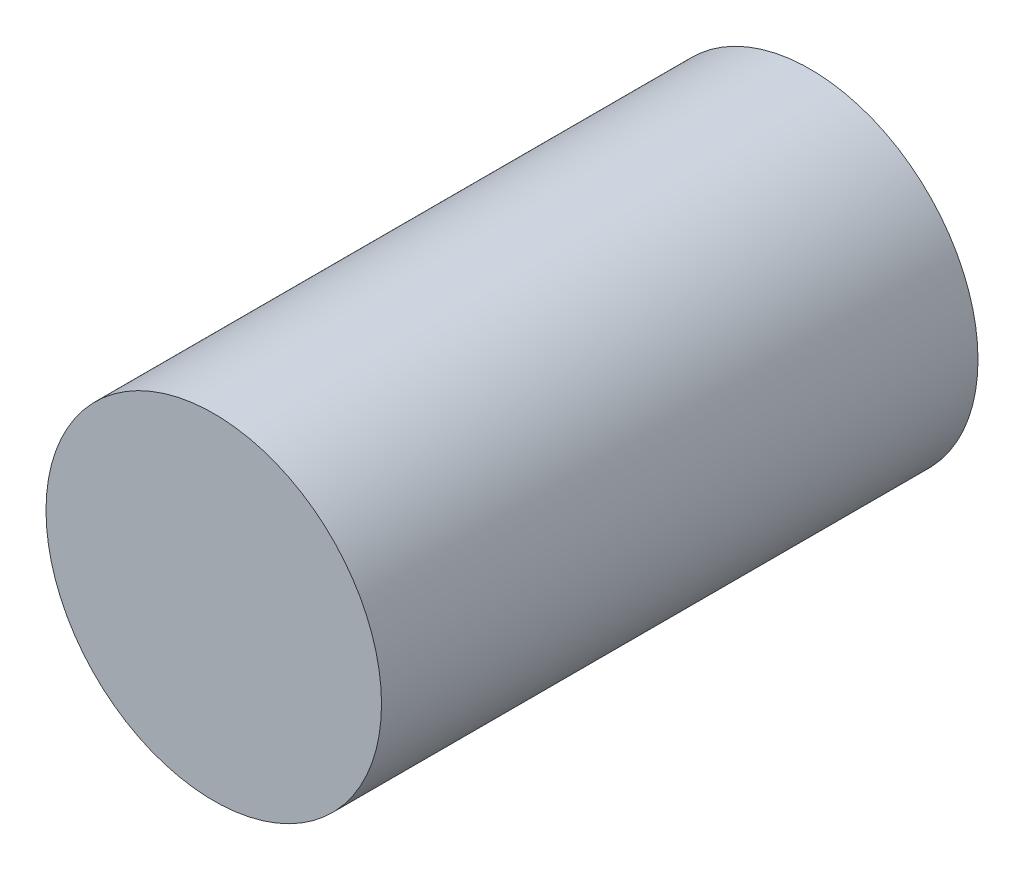
ISO-10303-21;
HEADER;
FILE_DESCRIPTION(('STEP AP214'),'2;1');
FILE_NAME('part.step','',(''),(''),'','','');
FILE_SCHEMA(('AUTOMOTIVE_DESIGN { 1 0 10303 214 1 1 1 1 }'));
ENDSEC;
DATA;
#1=APPLICATION_CONTEXT('core data for automotive mechanical design processes');
#2=APPLICATION_PROTOCOL_DEFINITION('international standard','automotive_design',2000,#1);
#3=PRODUCT_CONTEXT('',#1,'mechanical');
#4=PRODUCT('Part','Part','',(#3));
#5=PRODUCT_RELATED_PRODUCT_CATEGORY('part','',(#4));
#6=PRODUCT_DEFINITION_FORMATION('','',#4);
#7=PRODUCT_DEFINITION_CONTEXT('part definition',#1,'design');
#8=PRODUCT_DEFINITION('design','',#6,#7);
#9=PRODUCT_DEFINITION_SHAPE('','',#8);
#10=(LENGTH_UNIT() NAMED_UNIT(*) SI_UNIT(.MILLI.,.METRE.));
#11=(NAMED_UNIT(*) PLANE_ANGLE_UNIT() SI_UNIT($,.RADIAN.));
#12=(NAMED_UNIT(*) SI_UNIT($,.STERADIAN.) SOLID_ANGLE_UNIT());
#13=UNCERTAINTY_MEASURE_WITH_UNIT(LENGTH_MEASURE(1.E-05),#10,'distance_accuracy_value','');
#14=(GEOMETRIC_REPRESENTATION_CONTEXT(3) GLOBAL_UNCERTAINTY_ASSIGNED_CONTEXT((#13)) GLOBAL_UNIT_ASSIGNED_CONTEXT((#10,
#11,#12)) REPRESENTATION_CONTEXT('',''));
#15=CARTESIAN_POINT('',(0.,0.,0.));
#16=DIRECTION('',(0.,0.,1.));
#17=DIRECTION('',(1.,0.,0.));
#18=AXIS2_PLACEMENT_3D('',#15,#16,#17);
#19=CARTESIAN_POINT('',(0.,0.,50.8));
#20=DIRECTION('',(0.,0.,-1.));
#21=DIRECTION('',(-1.,0.,0.));
#22=AXIS2_PLACEMENT_3D('',#19,#20,#21);
#23=CYLINDRICAL_SURFACE('',#22,14.2875);
#24=CARTESIAN_POINT('',(0.,0.,50.8));
#25=DIRECTION('',(0.,0.,1.));
#26=DIRECTION('',(1.,0.,0.));
#27=AXIS2_PLACEMENT_3D('',#24,#25,#26);
#28=CIRCLE('',#27,14.2875);
#29=CARTESIAN_POINT('',(14.2875,0.,50.8));
#30=VERTEX_POINT('',#29);
#31=EDGE_CURVE('E10',#30,#30,#28,.T.);
#32=ORIENTED_EDGE('',*,*,#31,.F.);
#33=EDGE_LOOP('',(#32));
#34=FACE_BOUND('',#33,.T.);
#35=CARTESIAN_POINT('',(0.,0.,0.));
#36=DIRECTION('',(0.,0.,1.));
#37=DIRECTION('',(1.,0.,0.));
#38=AXIS2_PLACEMENT_3D('',#35,#36,#37);
#39=CIRCLE('',#38,14.2875);
#40=CARTESIAN_POINT('',(14.2875,0.,0.));
#41=VERTEX_POINT('',#40);
#42=EDGE_CURVE('E32',#41,#41,#39,.T.);
#43=ORIENTED_EDGE('',*,*,#42,.T.);
#44=EDGE_LOOP('',(#43));
#45=FACE_BOUND('',#44,.T.);
#46=ADVANCED_FACE('F29',(#34,#45),#23,.T.);
#47=CARTESIAN_POINT('',(0.,0.,50.8));
#48=DIRECTION('',(0.,0.,1.));
#49=DIRECTION('',(1.,0.,0.));
#50=AXIS2_PLACEMENT_3D('',#47,#48,#49);
#51=PLANE('',#50);
#52=ORIENTED_EDGE('',*,*,#31,.T.);
#53=EDGE_LOOP('',(#52));
#54=FACE_BOUND('',#53,.T.);
#55=ADVANCED_FACE('F44',(#54),#51,.T.);
#56=CARTESIAN_POINT('',(0.,0.,0.));
#57=DIRECTION('',(0.,0.,1.));
#58=DIRECTION('',(1.,0.,0.));
#59=AXIS2_PLACEMENT_3D('',#56,#57,#58);
#60=PLANE('',#59);
#61=ORIENTED_EDGE('',*,*,#42,.F.);
#62=EDGE_LOOP('',(#61));
#63=FACE_BOUND('',#62,.T.);
#64=ADVANCED_FACE('F42',(#63),#60,.F.);
#65=CLOSED_SHELL('',(#46,#55,#64));
#66=MANIFOLD_SOLID_BREP('B2',#65);
#67=ADVANCED_BREP_SHAPE_REPRESENTATION('',(#18,#66),#14);
#68=SHAPE_DEFINITION_REPRESENTATION(#9,#67);
ENDSEC;
END-ISO-10303-21;
